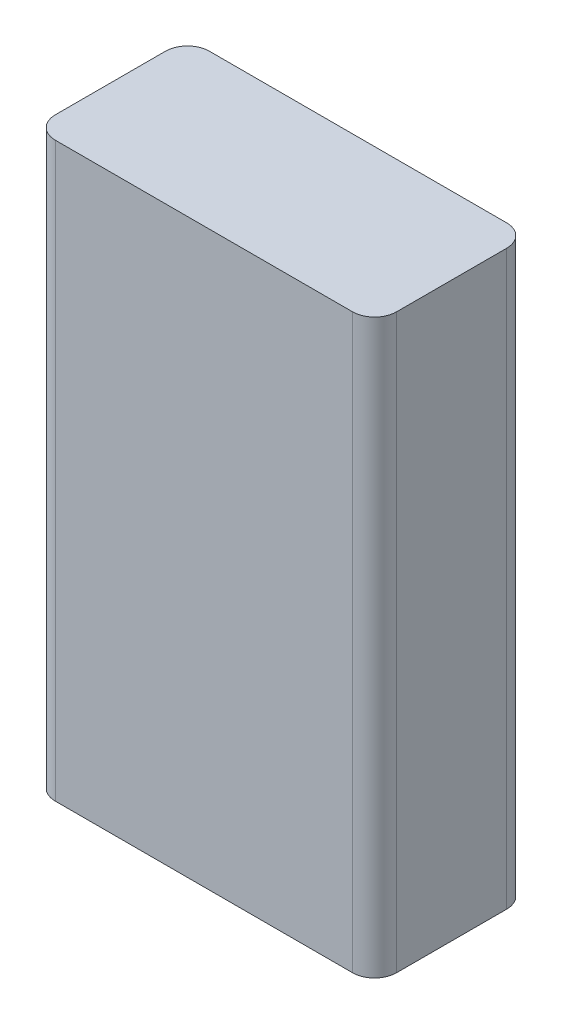
ISO-10303-21;
HEADER;
FILE_DESCRIPTION(('STEP AP214'),'2;1');
FILE_NAME('part.step','',(''),(''),'','','');
FILE_SCHEMA(('AUTOMOTIVE_DESIGN { 1 0 10303 214 1 1 1 1 }'));
ENDSEC;
DATA;
#1=APPLICATION_CONTEXT('core data for automotive mechanical design processes');
#2=APPLICATION_PROTOCOL_DEFINITION('international standard','automotive_design',2000,#1);
#3=PRODUCT_CONTEXT('',#1,'mechanical');
#4=PRODUCT('Part','Part','',(#3));
#5=PRODUCT_RELATED_PRODUCT_CATEGORY('part','',(#4));
#6=PRODUCT_DEFINITION_FORMATION('','',#4);
#7=PRODUCT_DEFINITION_CONTEXT('part definition',#1,'design');
#8=PRODUCT_DEFINITION('design','',#6,#7);
#9=PRODUCT_DEFINITION_SHAPE('','',#8);
#10=(LENGTH_UNIT() NAMED_UNIT(*) SI_UNIT(.MILLI.,.METRE.));
#11=(NAMED_UNIT(*) PLANE_ANGLE_UNIT() SI_UNIT($,.RADIAN.));
#12=(NAMED_UNIT(*) SI_UNIT($,.STERADIAN.) SOLID_ANGLE_UNIT());
#13=UNCERTAINTY_MEASURE_WITH_UNIT(LENGTH_MEASURE(1.E-05),#10,'distance_accuracy_value','');
#14=(GEOMETRIC_REPRESENTATION_CONTEXT(3) GLOBAL_UNCERTAINTY_ASSIGNED_CONTEXT((#13)) GLOBAL_UNIT_ASSIGNED_CONTEXT((#10,
#11,#12)) REPRESENTATION_CONTEXT('',''));
#15=CARTESIAN_POINT('',(0.,0.,0.));
#16=DIRECTION('',(0.,0.,1.));
#17=DIRECTION('',(1.,0.,0.));
#18=AXIS2_PLACEMENT_3D('',#15,#16,#17);
#19=CARTESIAN_POINT('',(-15.5,26.,-14.));
#20=DIRECTION('',(-1.,0.,0.));
#21=DIRECTION('',(0.,-1.,0.));
#22=AXIS2_PLACEMENT_3D('',#19,#20,#21);
#23=PLANE('',#22);
#24=DIRECTION('',(0.,0.,1.));
#25=VECTOR('',#24,1.);
#26=CARTESIAN_POINT('',(-15.5,-26.,-14.));
#27=LINE('',#26,#25);
#28=CARTESIAN_POINT('',(-15.5,-26.,-12.));
#29=VERTEX_POINT('',#28);
#30=CARTESIAN_POINT('',(-15.5,-26.,-2.));
#31=VERTEX_POINT('',#30);
#32=EDGE_CURVE('E136',#29,#31,#27,.T.);
#33=ORIENTED_EDGE('',*,*,#32,.T.);
#34=DIRECTION('',(0.,-1.,0.));
#35=VECTOR('',#34,1.);
#36=CARTESIAN_POINT('',(-15.5,26.,-2.));
#37=LINE('',#36,#35);
#38=CARTESIAN_POINT('',(-15.5,26.,-2.));
#39=VERTEX_POINT('',#38);
#40=EDGE_CURVE('E11',#31,#39,#37,.F.);
#41=ORIENTED_EDGE('',*,*,#40,.T.);
#42=DIRECTION('',(0.,0.,1.));
#43=VECTOR('',#42,1.);
#44=CARTESIAN_POINT('',(-15.5,26.,-14.));
#45=LINE('',#44,#43);
#46=CARTESIAN_POINT('',(-15.5,26.,-12.));
#47=VERTEX_POINT('',#46);
#48=EDGE_CURVE('E116',#47,#39,#45,.T.);
#49=ORIENTED_EDGE('',*,*,#48,.F.);
#50=DIRECTION('',(0.,-1.,0.));
#51=VECTOR('',#50,1.);
#52=CARTESIAN_POINT('',(-15.5,-26.,-12.));
#53=LINE('',#52,#51);
#54=EDGE_CURVE('E40',#47,#29,#53,.T.);
#55=ORIENTED_EDGE('',*,*,#54,.T.);
#56=EDGE_LOOP('',(#33,#41,#49,#55));
#57=FACE_BOUND('',#56,.T.);
#58=ADVANCED_FACE('F32',(#57),#23,.T.);
#59=CARTESIAN_POINT('',(-15.5,26.,-14.));
#60=DIRECTION('',(0.,1.,0.));
#61=DIRECTION('',(0.,0.,1.));
#62=AXIS2_PLACEMENT_3D('',#59,#60,#61);
#63=PLANE('',#62);
#64=DIRECTION('',(-1.,0.,0.));
#65=VECTOR('',#64,1.);
#66=CARTESIAN_POINT('',(-15.5,26.,0.));
#67=LINE('',#66,#65);
#68=CARTESIAN_POINT('',(13.5,26.,0.));
#69=VERTEX_POINT('',#68);
#70=CARTESIAN_POINT('',(-13.5,26.,0.));
#71=VERTEX_POINT('',#70);
#72=EDGE_CURVE('E114',#69,#71,#67,.T.);
#73=ORIENTED_EDGE('',*,*,#72,.F.);
#74=CARTESIAN_POINT('',(13.5,26.,-2.));
#75=DIRECTION('',(0.,1.,0.));
#76=DIRECTION('',(0.,0.,1.));
#77=AXIS2_PLACEMENT_3D('',#74,#75,#76);
#78=CIRCLE('',#77,2.);
#79=CARTESIAN_POINT('',(15.5,26.,-2.));
#80=VERTEX_POINT('',#79);
#81=EDGE_CURVE('E145',#69,#80,#78,.T.);
#82=ORIENTED_EDGE('',*,*,#81,.T.);
#83=DIRECTION('',(0.,0.,1.));
#84=VECTOR('',#83,1.);
#85=CARTESIAN_POINT('',(15.5,26.,-14.));
#86=LINE('',#85,#84);
#87=CARTESIAN_POINT('',(15.5,26.,-12.));
#88=VERTEX_POINT('',#87);
#89=EDGE_CURVE('E131',#88,#80,#86,.T.);
#90=ORIENTED_EDGE('',*,*,#89,.F.);
#91=CARTESIAN_POINT('',(13.5,26.,-12.));
#92=DIRECTION('',(0.,1.,0.));
#93=DIRECTION('',(0.,0.,1.));
#94=AXIS2_PLACEMENT_3D('',#91,#92,#93);
#95=CIRCLE('',#94,2.);
#96=CARTESIAN_POINT('',(13.5,26.,-14.));
#97=VERTEX_POINT('',#96);
#98=EDGE_CURVE('E143',#88,#97,#95,.T.);
#99=ORIENTED_EDGE('',*,*,#98,.T.);
#100=DIRECTION('',(-1.,0.,0.));
#101=VECTOR('',#100,1.);
#102=CARTESIAN_POINT('',(-15.5,26.,-14.));
#103=LINE('',#102,#101);
#104=CARTESIAN_POINT('',(-13.5,26.,-14.));
#105=VERTEX_POINT('',#104);
#106=EDGE_CURVE('E126',#97,#105,#103,.T.);
#107=ORIENTED_EDGE('',*,*,#106,.T.);
#108=CARTESIAN_POINT('',(-13.5,26.,-12.));
#109=DIRECTION('',(0.,1.,0.));
#110=DIRECTION('',(0.,0.,1.));
#111=AXIS2_PLACEMENT_3D('',#108,#109,#110);
#112=CIRCLE('',#111,2.);
#113=EDGE_CURVE('E139',#105,#47,#112,.T.);
#114=ORIENTED_EDGE('',*,*,#113,.T.);
#115=ORIENTED_EDGE('',*,*,#48,.T.);
#116=CARTESIAN_POINT('',(-13.5,26.,-2.));
#117=DIRECTION('',(0.,1.,0.));
#118=DIRECTION('',(0.,0.,1.));
#119=AXIS2_PLACEMENT_3D('',#116,#117,#118);
#120=CIRCLE('',#119,2.);
#121=EDGE_CURVE('E141',#39,#71,#120,.T.);
#122=ORIENTED_EDGE('',*,*,#121,.T.);
#123=EDGE_LOOP('',(#73,#82,#90,#99,#107,#114,#115,#122));
#124=FACE_BOUND('',#123,.T.);
#125=ADVANCED_FACE('F167',(#124),#63,.T.);
#126=CARTESIAN_POINT('',(15.5,26.,-14.));
#127=DIRECTION('',(1.,0.,0.));
#128=DIRECTION('',(0.,1.,0.));
#129=AXIS2_PLACEMENT_3D('',#126,#127,#128);
#130=PLANE('',#129);
#131=ORIENTED_EDGE('',*,*,#89,.T.);
#132=DIRECTION('',(0.,1.,0.));
#133=VECTOR('',#132,1.);
#134=CARTESIAN_POINT('',(15.5,26.,-2.));
#135=LINE('',#134,#133);
#136=CARTESIAN_POINT('',(15.5,-26.,-2.));
#137=VERTEX_POINT('',#136);
#138=EDGE_CURVE('E150',#80,#137,#135,.F.);
#139=ORIENTED_EDGE('',*,*,#138,.T.);
#140=DIRECTION('',(0.,0.,1.));
#141=VECTOR('',#140,1.);
#142=CARTESIAN_POINT('',(15.5,-26.,-14.));
#143=LINE('',#142,#141);
#144=CARTESIAN_POINT('',(15.5,-26.,-12.));
#145=VERTEX_POINT('',#144);
#146=EDGE_CURVE('E134',#145,#137,#143,.T.);
#147=ORIENTED_EDGE('',*,*,#146,.F.);
#148=DIRECTION('',(0.,1.,0.));
#149=VECTOR('',#148,1.);
#150=CARTESIAN_POINT('',(15.5,26.,-12.));
#151=LINE('',#150,#149);
#152=EDGE_CURVE('E147',#145,#88,#151,.T.);
#153=ORIENTED_EDGE('',*,*,#152,.T.);
#154=EDGE_LOOP('',(#131,#139,#147,#153));
#155=FACE_BOUND('',#154,.T.);
#156=ADVANCED_FACE('F175',(#155),#130,.T.);
#157=CARTESIAN_POINT('',(-15.5,-26.,-14.));
#158=DIRECTION('',(0.,-1.,0.));
#159=DIRECTION('',(0.,0.,-1.));
#160=AXIS2_PLACEMENT_3D('',#157,#158,#159);
#161=PLANE('',#160);
#162=ORIENTED_EDGE('',*,*,#146,.T.);
#163=CARTESIAN_POINT('',(13.5,-26.,-2.));
#164=DIRECTION('',(0.,-1.,0.));
#165=DIRECTION('',(0.,0.,-1.));
#166=AXIS2_PLACEMENT_3D('',#163,#164,#165);
#167=CIRCLE('',#166,2.);
#168=CARTESIAN_POINT('',(13.5,-26.,0.));
#169=VERTEX_POINT('',#168);
#170=EDGE_CURVE('E121',#137,#169,#167,.T.);
#171=ORIENTED_EDGE('',*,*,#170,.T.);
#172=DIRECTION('',(1.,0.,0.));
#173=VECTOR('',#172,1.);
#174=CARTESIAN_POINT('',(-15.5,-26.,0.));
#175=LINE('',#174,#173);
#176=CARTESIAN_POINT('',(-13.5,-26.,0.));
#177=VERTEX_POINT('',#176);
#178=EDGE_CURVE('E111',#177,#169,#175,.T.);
#179=ORIENTED_EDGE('',*,*,#178,.F.);
#180=CARTESIAN_POINT('',(-13.5,-26.,-2.));
#181=DIRECTION('',(0.,-1.,0.));
#182=DIRECTION('',(0.,0.,-1.));
#183=AXIS2_PLACEMENT_3D('',#180,#181,#182);
#184=CIRCLE('',#183,2.);
#185=EDGE_CURVE('E97',#177,#31,#184,.T.);
#186=ORIENTED_EDGE('',*,*,#185,.T.);
#187=ORIENTED_EDGE('',*,*,#32,.F.);
#188=CARTESIAN_POINT('',(-13.5,-26.,-12.));
#189=DIRECTION('',(0.,-1.,0.));
#190=DIRECTION('',(0.,0.,-1.));
#191=AXIS2_PLACEMENT_3D('',#188,#189,#190);
#192=CIRCLE('',#191,2.);
#193=CARTESIAN_POINT('',(-13.5,-26.,-14.));
#194=VERTEX_POINT('',#193);
#195=EDGE_CURVE('E54',#29,#194,#192,.T.);
#196=ORIENTED_EDGE('',*,*,#195,.T.);
#197=DIRECTION('',(1.,0.,0.));
#198=VECTOR('',#197,1.);
#199=CARTESIAN_POINT('',(-15.5,-26.,-14.));
#200=LINE('',#199,#198);
#201=CARTESIAN_POINT('',(13.5,-26.,-14.));
#202=VERTEX_POINT('',#201);
#203=EDGE_CURVE('E123',#194,#202,#200,.T.);
#204=ORIENTED_EDGE('',*,*,#203,.T.);
#205=CARTESIAN_POINT('',(13.5,-26.,-12.));
#206=DIRECTION('',(0.,-1.,0.));
#207=DIRECTION('',(0.,0.,-1.));
#208=AXIS2_PLACEMENT_3D('',#205,#206,#207);
#209=CIRCLE('',#208,2.);
#210=EDGE_CURVE('E104',#202,#145,#209,.T.);
#211=ORIENTED_EDGE('',*,*,#210,.T.);
#212=EDGE_LOOP('',(#162,#171,#179,#186,#187,#196,#204,#211));
#213=FACE_BOUND('',#212,.T.);
#214=ADVANCED_FACE('F119',(#213),#161,.T.);
#215=CARTESIAN_POINT('',(0.,0.,-14.));
#216=DIRECTION('',(0.,0.,1.));
#217=DIRECTION('',(1.,0.,0.));
#218=AXIS2_PLACEMENT_3D('',#215,#216,#217);
#219=PLANE('',#218);
#220=ORIENTED_EDGE('',*,*,#106,.F.);
#221=DIRECTION('',(0.,1.,0.));
#222=VECTOR('',#221,1.);
#223=CARTESIAN_POINT('',(13.5,-26.,-14.));
#224=LINE('',#223,#222);
#225=EDGE_CURVE('E47',#97,#202,#224,.F.);
#226=ORIENTED_EDGE('',*,*,#225,.T.);
#227=ORIENTED_EDGE('',*,*,#203,.F.);
#228=DIRECTION('',(0.,-1.,0.));
#229=VECTOR('',#228,1.);
#230=CARTESIAN_POINT('',(-13.5,26.,-14.));
#231=LINE('',#230,#229);
#232=EDGE_CURVE('E155',#194,#105,#231,.F.);
#233=ORIENTED_EDGE('',*,*,#232,.T.);
#234=EDGE_LOOP('',(#220,#226,#227,#233));
#235=FACE_BOUND('',#234,.T.);
#236=ADVANCED_FACE('F165',(#235),#219,.F.);
#237=CARTESIAN_POINT('',(0.,0.,0.));
#238=DIRECTION('',(0.,0.,1.));
#239=DIRECTION('',(1.,0.,0.));
#240=AXIS2_PLACEMENT_3D('',#237,#238,#239);
#241=PLANE('',#240);
#242=ORIENTED_EDGE('',*,*,#178,.T.);
#243=DIRECTION('',(0.,1.,0.));
#244=VECTOR('',#243,1.);
#245=CARTESIAN_POINT('',(13.5,0.,0.));
#246=LINE('',#245,#244);
#247=EDGE_CURVE('E115',#169,#69,#246,.T.);
#248=ORIENTED_EDGE('',*,*,#247,.T.);
#249=ORIENTED_EDGE('',*,*,#72,.T.);
#250=DIRECTION('',(0.,-1.,0.));
#251=VECTOR('',#250,1.);
#252=CARTESIAN_POINT('',(-13.5,0.,0.));
#253=LINE('',#252,#251);
#254=EDGE_CURVE('E101',#71,#177,#253,.T.);
#255=ORIENTED_EDGE('',*,*,#254,.T.);
#256=EDGE_LOOP('',(#242,#248,#249,#255));
#257=FACE_BOUND('',#256,.T.);
#258=ADVANCED_FACE('F109',(#257),#241,.T.);
#259=CARTESIAN_POINT('',(13.5,0.,-2.));
#260=DIRECTION('',(0.,1.,0.));
#261=DIRECTION('',(-1.,0.,0.));
#262=AXIS2_PLACEMENT_3D('',#259,#260,#261);
#263=CYLINDRICAL_SURFACE('',#262,2.);
#264=ORIENTED_EDGE('',*,*,#170,.F.);
#265=ORIENTED_EDGE('',*,*,#138,.F.);
#266=ORIENTED_EDGE('',*,*,#81,.F.);
#267=ORIENTED_EDGE('',*,*,#247,.F.);
#268=EDGE_LOOP('',(#264,#265,#266,#267));
#269=FACE_BOUND('',#268,.T.);
#270=ADVANCED_FACE('F178',(#269),#263,.T.);
#271=CARTESIAN_POINT('',(13.5,26.,-12.));
#272=DIRECTION('',(0.,-1.,0.));
#273=DIRECTION('',(1.,0.,0.));
#274=AXIS2_PLACEMENT_3D('',#271,#272,#273);
#275=CYLINDRICAL_SURFACE('',#274,2.);
#276=ORIENTED_EDGE('',*,*,#210,.F.);
#277=ORIENTED_EDGE('',*,*,#225,.F.);
#278=ORIENTED_EDGE('',*,*,#98,.F.);
#279=ORIENTED_EDGE('',*,*,#152,.F.);
#280=EDGE_LOOP('',(#276,#277,#278,#279));
#281=FACE_BOUND('',#280,.T.);
#282=ADVANCED_FACE('F173',(#281),#275,.T.);
#283=CARTESIAN_POINT('',(-13.5,0.,-2.));
#284=DIRECTION('',(0.,-1.,0.));
#285=DIRECTION('',(1.,0.,0.));
#286=AXIS2_PLACEMENT_3D('',#283,#284,#285);
#287=CYLINDRICAL_SURFACE('',#286,2.);
#288=ORIENTED_EDGE('',*,*,#121,.F.);
#289=ORIENTED_EDGE('',*,*,#40,.F.);
#290=ORIENTED_EDGE('',*,*,#185,.F.);
#291=ORIENTED_EDGE('',*,*,#254,.F.);
#292=EDGE_LOOP('',(#288,#289,#290,#291));
#293=FACE_BOUND('',#292,.T.);
#294=ADVANCED_FACE('F100',(#293),#287,.T.);
#295=CARTESIAN_POINT('',(-13.5,26.,-12.));
#296=DIRECTION('',(0.,1.,0.));
#297=DIRECTION('',(-1.,0.,0.));
#298=AXIS2_PLACEMENT_3D('',#295,#296,#297);
#299=CYLINDRICAL_SURFACE('',#298,2.);
#300=ORIENTED_EDGE('',*,*,#113,.F.);
#301=ORIENTED_EDGE('',*,*,#232,.F.);
#302=ORIENTED_EDGE('',*,*,#195,.F.);
#303=ORIENTED_EDGE('',*,*,#54,.F.);
#304=EDGE_LOOP('',(#300,#301,#302,#303));
#305=FACE_BOUND('',#304,.T.);
#306=ADVANCED_FACE('F34',(#305),#299,.T.);
#307=CLOSED_SHELL('',(#58,#125,#156,#214,#236,#258,#270,#282,#294,#306));
#308=MANIFOLD_SOLID_BREP('B2',#307);
#309=ADVANCED_BREP_SHAPE_REPRESENTATION('',(#18,#308),#14);
#310=SHAPE_DEFINITION_REPRESENTATION(#9,#309);
ENDSEC;
END-ISO-10303-21;
